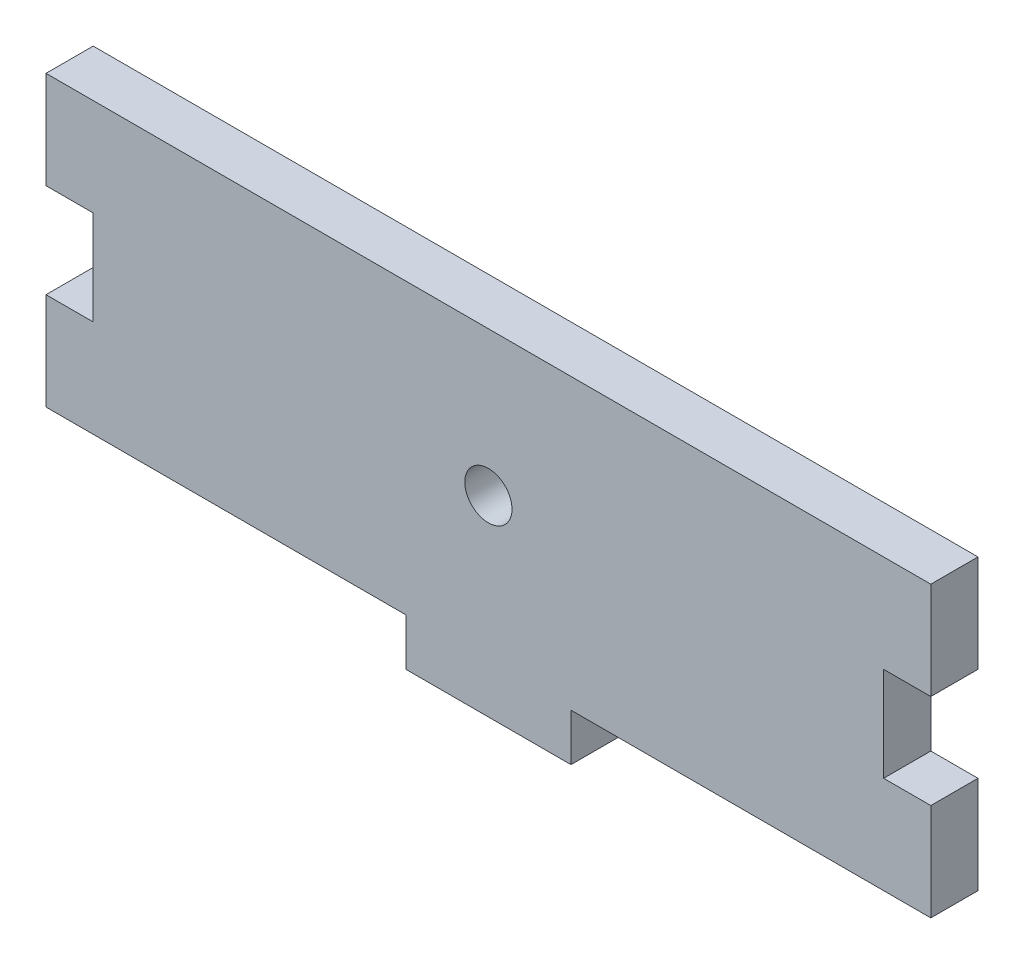
ISO-10303-21;
HEADER;
FILE_DESCRIPTION(('STEP AP214'),'2;1');
FILE_NAME('part.step','',(''),(''),'','','');
FILE_SCHEMA(('AUTOMOTIVE_DESIGN { 1 0 10303 214 1 1 1 1 }'));
ENDSEC;
DATA;
#1=APPLICATION_CONTEXT('core data for automotive mechanical design processes');
#2=APPLICATION_PROTOCOL_DEFINITION('international standard','automotive_design',2000,#1);
#3=PRODUCT_CONTEXT('',#1,'mechanical');
#4=PRODUCT('Part','Part','',(#3));
#5=PRODUCT_RELATED_PRODUCT_CATEGORY('part','',(#4));
#6=PRODUCT_DEFINITION_FORMATION('','',#4);
#7=PRODUCT_DEFINITION_CONTEXT('part definition',#1,'design');
#8=PRODUCT_DEFINITION('design','',#6,#7);
#9=PRODUCT_DEFINITION_SHAPE('','',#8);
#10=(LENGTH_UNIT() NAMED_UNIT(*) SI_UNIT(.MILLI.,.METRE.));
#11=(NAMED_UNIT(*) PLANE_ANGLE_UNIT() SI_UNIT($,.RADIAN.));
#12=(NAMED_UNIT(*) SI_UNIT($,.STERADIAN.) SOLID_ANGLE_UNIT());
#13=UNCERTAINTY_MEASURE_WITH_UNIT(LENGTH_MEASURE(1.E-05),#10,'distance_accuracy_value','');
#14=(GEOMETRIC_REPRESENTATION_CONTEXT(3) GLOBAL_UNCERTAINTY_ASSIGNED_CONTEXT((#13)) GLOBAL_UNIT_ASSIGNED_CONTEXT((#10,
#11,#12)) REPRESENTATION_CONTEXT('',''));
#15=CARTESIAN_POINT('',(0.,0.,0.));
#16=DIRECTION('',(0.,0.,1.));
#17=DIRECTION('',(1.,0.,0.));
#18=AXIS2_PLACEMENT_3D('',#15,#16,#17);
#19=CARTESIAN_POINT('',(-37.5,-12.25,4.));
#20=DIRECTION('',(0.,0.,-1.));
#21=DIRECTION('',(-1.,0.,0.));
#22=AXIS2_PLACEMENT_3D('',#19,#20,#21);
#23=PLANE('',#22);
#24=DIRECTION('',(0.,-1.,0.));
#25=VECTOR('',#24,1.);
#26=CARTESIAN_POINT('',(-37.5,-4.00000000000001,4.));
#27=LINE('',#26,#25);
#28=CARTESIAN_POINT('',(-37.5,-4.00000000000001,4.));
#29=VERTEX_POINT('',#28);
#30=CARTESIAN_POINT('',(-37.5,-12.25,4.));
#31=VERTEX_POINT('',#30);
#32=EDGE_CURVE('E216',#29,#31,#27,.T.);
#33=ORIENTED_EDGE('',*,*,#32,.T.);
#34=DIRECTION('',(1.,0.,0.));
#35=VECTOR('',#34,1.);
#36=CARTESIAN_POINT('',(-6.99999999999999,-12.25,4.));
#37=LINE('',#36,#35);
#38=CARTESIAN_POINT('',(-6.99999999999999,-12.25,4.));
#39=VERTEX_POINT('',#38);
#40=EDGE_CURVE('E124',#31,#39,#37,.T.);
#41=ORIENTED_EDGE('',*,*,#40,.T.);
#42=DIRECTION('',(0.,-1.,0.));
#43=VECTOR('',#42,1.);
#44=CARTESIAN_POINT('',(-7.,-16.25,4.));
#45=LINE('',#44,#43);
#46=CARTESIAN_POINT('',(-7.,-16.25,4.));
#47=VERTEX_POINT('',#46);
#48=EDGE_CURVE('E255',#39,#47,#45,.T.);
#49=ORIENTED_EDGE('',*,*,#48,.T.);
#50=DIRECTION('',(1.,0.,0.));
#51=VECTOR('',#50,1.);
#52=CARTESIAN_POINT('',(7.,-16.25,4.));
#53=LINE('',#52,#51);
#54=CARTESIAN_POINT('',(7.,-16.25,4.));
#55=VERTEX_POINT('',#54);
#56=EDGE_CURVE('E274',#47,#55,#53,.T.);
#57=ORIENTED_EDGE('',*,*,#56,.T.);
#58=DIRECTION('',(0.,1.,0.));
#59=VECTOR('',#58,1.);
#60=CARTESIAN_POINT('',(7.00000000000001,-12.25,4.));
#61=LINE('',#60,#59);
#62=CARTESIAN_POINT('',(7.00000000000001,-12.25,4.));
#63=VERTEX_POINT('',#62);
#64=EDGE_CURVE('E271',#55,#63,#61,.T.);
#65=ORIENTED_EDGE('',*,*,#64,.T.);
#66=DIRECTION('',(1.,0.,0.));
#67=VECTOR('',#66,1.);
#68=CARTESIAN_POINT('',(37.5,-12.25,4.));
#69=LINE('',#68,#67);
#70=CARTESIAN_POINT('',(37.5,-12.25,4.));
#71=VERTEX_POINT('',#70);
#72=EDGE_CURVE('E273',#63,#71,#69,.T.);
#73=ORIENTED_EDGE('',*,*,#72,.T.);
#74=DIRECTION('',(0.,1.,0.));
#75=VECTOR('',#74,1.);
#76=CARTESIAN_POINT('',(37.5,-3.99999999999999,4.));
#77=LINE('',#76,#75);
#78=CARTESIAN_POINT('',(37.5,-3.99999999999999,4.));
#79=VERTEX_POINT('',#78);
#80=EDGE_CURVE('E276',#71,#79,#77,.T.);
#81=ORIENTED_EDGE('',*,*,#80,.T.);
#82=DIRECTION('',(-1.,0.,0.));
#83=VECTOR('',#82,1.);
#84=CARTESIAN_POINT('',(33.4999999999999,-3.99999999999999,4.));
#85=LINE('',#84,#83);
#86=CARTESIAN_POINT('',(33.4999999999999,-3.99999999999999,4.));
#87=VERTEX_POINT('',#86);
#88=EDGE_CURVE('E282',#79,#87,#85,.T.);
#89=ORIENTED_EDGE('',*,*,#88,.T.);
#90=DIRECTION('',(0.,1.,0.));
#91=VECTOR('',#90,1.);
#92=CARTESIAN_POINT('',(33.5,3.99999999999999,4.));
#93=LINE('',#92,#91);
#94=CARTESIAN_POINT('',(33.5,3.99999999999999,4.));
#95=VERTEX_POINT('',#94);
#96=EDGE_CURVE('E284',#87,#95,#93,.T.);
#97=ORIENTED_EDGE('',*,*,#96,.T.);
#98=DIRECTION('',(1.,0.,0.));
#99=VECTOR('',#98,1.);
#100=CARTESIAN_POINT('',(37.5,4.,4.));
#101=LINE('',#100,#99);
#102=CARTESIAN_POINT('',(37.5,4.,4.));
#103=VERTEX_POINT('',#102);
#104=EDGE_CURVE('E286',#95,#103,#101,.T.);
#105=ORIENTED_EDGE('',*,*,#104,.T.);
#106=DIRECTION('',(0.,1.,0.));
#107=VECTOR('',#106,1.);
#108=CARTESIAN_POINT('',(37.5,12.25,4.));
#109=LINE('',#108,#107);
#110=CARTESIAN_POINT('',(37.5,12.25,4.));
#111=VERTEX_POINT('',#110);
#112=EDGE_CURVE('E288',#103,#111,#109,.T.);
#113=ORIENTED_EDGE('',*,*,#112,.T.);
#114=DIRECTION('',(-1.,0.,0.));
#115=VECTOR('',#114,1.);
#116=CARTESIAN_POINT('',(37.5,12.25,4.));
#117=LINE('',#116,#115);
#118=CARTESIAN_POINT('',(-37.5,12.25,4.));
#119=VERTEX_POINT('',#118);
#120=EDGE_CURVE('E290',#111,#119,#117,.T.);
#121=ORIENTED_EDGE('',*,*,#120,.T.);
#122=DIRECTION('',(0.,-1.,0.));
#123=VECTOR('',#122,1.);
#124=CARTESIAN_POINT('',(-37.5,12.25,4.));
#125=LINE('',#124,#123);
#126=CARTESIAN_POINT('',(-37.5,4.00000000000002,4.));
#127=VERTEX_POINT('',#126);
#128=EDGE_CURVE('E167',#119,#127,#125,.T.);
#129=ORIENTED_EDGE('',*,*,#128,.T.);
#130=DIRECTION('',(1.,0.,0.));
#131=VECTOR('',#130,1.);
#132=CARTESIAN_POINT('',(-37.5,4.00000000000002,4.));
#133=LINE('',#132,#131);
#134=CARTESIAN_POINT('',(-33.5,4.00000000000001,4.));
#135=VERTEX_POINT('',#134);
#136=EDGE_CURVE('E161',#127,#135,#133,.T.);
#137=ORIENTED_EDGE('',*,*,#136,.T.);
#138=DIRECTION('',(0.,-1.,0.));
#139=VECTOR('',#138,1.);
#140=CARTESIAN_POINT('',(-33.5,4.00000000000001,4.));
#141=LINE('',#140,#139);
#142=CARTESIAN_POINT('',(-33.5,-4.,4.));
#143=VERTEX_POINT('',#142);
#144=EDGE_CURVE('E165',#135,#143,#141,.T.);
#145=ORIENTED_EDGE('',*,*,#144,.T.);
#146=DIRECTION('',(-1.,0.,0.));
#147=VECTOR('',#146,1.);
#148=CARTESIAN_POINT('',(-33.5,-4.,4.));
#149=LINE('',#148,#147);
#150=EDGE_CURVE('E57',#143,#29,#149,.T.);
#151=ORIENTED_EDGE('',*,*,#150,.T.);
#152=EDGE_LOOP('',(#33,#41,#49,#57,#65,#73,#81,#89,#97,#105,#113,#121,#129,#137,#145,#151));
#153=FACE_BOUND('',#152,.T.);
#154=CARTESIAN_POINT('',(0.,0.,4.));
#155=DIRECTION('',(0.,0.,1.));
#156=DIRECTION('',(1.,0.,0.));
#157=AXIS2_PLACEMENT_3D('',#154,#155,#156);
#158=CIRCLE('',#157,2.);
#159=CARTESIAN_POINT('',(2.00000000000001,0.,4.));
#160=VERTEX_POINT('',#159);
#161=EDGE_CURVE('E189',#160,#160,#158,.T.);
#162=ORIENTED_EDGE('',*,*,#161,.F.);
#163=EDGE_LOOP('',(#162));
#164=FACE_BOUND('',#163,.T.);
#165=ADVANCED_FACE('F40',(#153,#164),#23,.F.);
#166=CARTESIAN_POINT('',(-37.5,-12.25,0.));
#167=DIRECTION('',(0.,0.,-1.));
#168=DIRECTION('',(-1.,0.,0.));
#169=AXIS2_PLACEMENT_3D('',#166,#167,#168);
#170=PLANE('',#169);
#171=DIRECTION('',(0.,-1.,0.));
#172=VECTOR('',#171,1.);
#173=CARTESIAN_POINT('',(-37.5,-4.00000000000001,0.));
#174=LINE('',#173,#172);
#175=CARTESIAN_POINT('',(-37.5,-4.00000000000001,0.));
#176=VERTEX_POINT('',#175);
#177=CARTESIAN_POINT('',(-37.5,-12.25,0.));
#178=VERTEX_POINT('',#177);
#179=EDGE_CURVE('E185',#176,#178,#174,.T.);
#180=ORIENTED_EDGE('',*,*,#179,.F.);
#181=DIRECTION('',(-1.,0.,0.));
#182=VECTOR('',#181,1.);
#183=CARTESIAN_POINT('',(-33.5,-4.,0.));
#184=LINE('',#183,#182);
#185=CARTESIAN_POINT('',(-33.5,-4.,0.));
#186=VERTEX_POINT('',#185);
#187=EDGE_CURVE('E116',#186,#176,#184,.T.);
#188=ORIENTED_EDGE('',*,*,#187,.F.);
#189=DIRECTION('',(0.,-1.,0.));
#190=VECTOR('',#189,1.);
#191=CARTESIAN_POINT('',(-33.5,4.00000000000001,0.));
#192=LINE('',#191,#190);
#193=CARTESIAN_POINT('',(-33.5,4.00000000000001,0.));
#194=VERTEX_POINT('',#193);
#195=EDGE_CURVE('E110',#194,#186,#192,.T.);
#196=ORIENTED_EDGE('',*,*,#195,.F.);
#197=DIRECTION('',(1.,0.,0.));
#198=VECTOR('',#197,1.);
#199=CARTESIAN_POINT('',(-37.5,4.00000000000002,0.));
#200=LINE('',#199,#198);
#201=CARTESIAN_POINT('',(-37.5,4.00000000000002,0.));
#202=VERTEX_POINT('',#201);
#203=EDGE_CURVE('E175',#202,#194,#200,.T.);
#204=ORIENTED_EDGE('',*,*,#203,.F.);
#205=DIRECTION('',(0.,-1.,0.));
#206=VECTOR('',#205,1.);
#207=CARTESIAN_POINT('',(-37.5,12.25,0.));
#208=LINE('',#207,#206);
#209=CARTESIAN_POINT('',(-37.5,12.25,0.));
#210=VERTEX_POINT('',#209);
#211=EDGE_CURVE('E211',#210,#202,#208,.T.);
#212=ORIENTED_EDGE('',*,*,#211,.F.);
#213=DIRECTION('',(-1.,0.,0.));
#214=VECTOR('',#213,1.);
#215=CARTESIAN_POINT('',(37.5,12.25,0.));
#216=LINE('',#215,#214);
#217=CARTESIAN_POINT('',(37.5,12.25,0.));
#218=VERTEX_POINT('',#217);
#219=EDGE_CURVE('E209',#218,#210,#216,.T.);
#220=ORIENTED_EDGE('',*,*,#219,.F.);
#221=DIRECTION('',(0.,1.,0.));
#222=VECTOR('',#221,1.);
#223=CARTESIAN_POINT('',(37.5,12.25,0.));
#224=LINE('',#223,#222);
#225=CARTESIAN_POINT('',(37.5,4.,0.));
#226=VERTEX_POINT('',#225);
#227=EDGE_CURVE('E207',#226,#218,#224,.T.);
#228=ORIENTED_EDGE('',*,*,#227,.F.);
#229=DIRECTION('',(1.,0.,0.));
#230=VECTOR('',#229,1.);
#231=CARTESIAN_POINT('',(37.5,4.,0.));
#232=LINE('',#231,#230);
#233=CARTESIAN_POINT('',(33.5,3.99999999999999,0.));
#234=VERTEX_POINT('',#233);
#235=EDGE_CURVE('E205',#234,#226,#232,.T.);
#236=ORIENTED_EDGE('',*,*,#235,.F.);
#237=DIRECTION('',(0.,1.,0.));
#238=VECTOR('',#237,1.);
#239=CARTESIAN_POINT('',(33.5,3.99999999999999,0.));
#240=LINE('',#239,#238);
#241=CARTESIAN_POINT('',(33.5,-4.00000000000001,0.));
#242=VERTEX_POINT('',#241);
#243=EDGE_CURVE('E203',#242,#234,#240,.T.);
#244=ORIENTED_EDGE('',*,*,#243,.F.);
#245=DIRECTION('',(-1.,0.,0.));
#246=VECTOR('',#245,1.);
#247=CARTESIAN_POINT('',(33.5,-4.00000000000001,0.));
#248=LINE('',#247,#246);
#249=CARTESIAN_POINT('',(37.5,-3.99999999999999,0.));
#250=VERTEX_POINT('',#249);
#251=EDGE_CURVE('E201',#250,#242,#248,.T.);
#252=ORIENTED_EDGE('',*,*,#251,.F.);
#253=DIRECTION('',(0.,1.,0.));
#254=VECTOR('',#253,1.);
#255=CARTESIAN_POINT('',(37.5,-3.99999999999999,0.));
#256=LINE('',#255,#254);
#257=CARTESIAN_POINT('',(37.5,-12.25,0.));
#258=VERTEX_POINT('',#257);
#259=EDGE_CURVE('E199',#258,#250,#256,.T.);
#260=ORIENTED_EDGE('',*,*,#259,.F.);
#261=DIRECTION('',(1.,0.,0.));
#262=VECTOR('',#261,1.);
#263=CARTESIAN_POINT('',(37.5,-12.25,0.));
#264=LINE('',#263,#262);
#265=CARTESIAN_POINT('',(7.00000000000001,-12.25,0.));
#266=VERTEX_POINT('',#265);
#267=EDGE_CURVE('E197',#266,#258,#264,.T.);
#268=ORIENTED_EDGE('',*,*,#267,.F.);
#269=DIRECTION('',(0.,1.,0.));
#270=VECTOR('',#269,1.);
#271=CARTESIAN_POINT('',(7.00000000000001,-12.25,0.));
#272=LINE('',#271,#270);
#273=CARTESIAN_POINT('',(7.,-16.25,0.));
#274=VERTEX_POINT('',#273);
#275=EDGE_CURVE('E195',#274,#266,#272,.T.);
#276=ORIENTED_EDGE('',*,*,#275,.F.);
#277=DIRECTION('',(1.,0.,0.));
#278=VECTOR('',#277,1.);
#279=CARTESIAN_POINT('',(7.,-16.25,0.));
#280=LINE('',#279,#278);
#281=CARTESIAN_POINT('',(-7.,-16.25,0.));
#282=VERTEX_POINT('',#281);
#283=EDGE_CURVE('E193',#282,#274,#280,.T.);
#284=ORIENTED_EDGE('',*,*,#283,.F.);
#285=DIRECTION('',(0.,-1.,0.));
#286=VECTOR('',#285,1.);
#287=CARTESIAN_POINT('',(-7.,-16.25,0.));
#288=LINE('',#287,#286);
#289=CARTESIAN_POINT('',(-6.99999999999999,-12.25,0.));
#290=VERTEX_POINT('',#289);
#291=EDGE_CURVE('E191',#290,#282,#288,.T.);
#292=ORIENTED_EDGE('',*,*,#291,.F.);
#293=DIRECTION('',(1.,0.,0.));
#294=VECTOR('',#293,1.);
#295=CARTESIAN_POINT('',(-6.99999999999999,-12.25,0.));
#296=LINE('',#295,#294);
#297=EDGE_CURVE('E188',#178,#290,#296,.T.);
#298=ORIENTED_EDGE('',*,*,#297,.F.);
#299=EDGE_LOOP('',(#180,#188,#196,#204,#212,#220,#228,#236,#244,#252,#260,#268,#276,#284,#292,#298));
#300=FACE_BOUND('',#299,.T.);
#301=CARTESIAN_POINT('',(0.,0.,0.));
#302=DIRECTION('',(0.,0.,1.));
#303=DIRECTION('',(1.,0.,0.));
#304=AXIS2_PLACEMENT_3D('',#301,#302,#303);
#305=CIRCLE('',#304,2.);
#306=CARTESIAN_POINT('',(2.00000000000001,0.,0.));
#307=VERTEX_POINT('',#306);
#308=EDGE_CURVE('E451',#307,#307,#305,.T.);
#309=ORIENTED_EDGE('',*,*,#308,.T.);
#310=EDGE_LOOP('',(#309));
#311=FACE_BOUND('',#310,.T.);
#312=ADVANCED_FACE('F259',(#300,#311),#170,.T.);
#313=CARTESIAN_POINT('',(-37.5,-4.00000000000001,4.));
#314=DIRECTION('',(1.,0.,0.));
#315=DIRECTION('',(0.,0.,-1.));
#316=AXIS2_PLACEMENT_3D('',#313,#314,#315);
#317=PLANE('',#316);
#318=ORIENTED_EDGE('',*,*,#179,.T.);
#319=DIRECTION('',(0.,0.,-1.));
#320=VECTOR('',#319,1.);
#321=CARTESIAN_POINT('',(-37.5,-12.25,4.));
#322=LINE('',#321,#320);
#323=EDGE_CURVE('E13',#31,#178,#322,.T.);
#324=ORIENTED_EDGE('',*,*,#323,.F.);
#325=ORIENTED_EDGE('',*,*,#32,.F.);
#326=DIRECTION('',(0.,0.,-1.));
#327=VECTOR('',#326,1.);
#328=CARTESIAN_POINT('',(-37.5,-4.00000000000001,4.));
#329=LINE('',#328,#327);
#330=EDGE_CURVE('E181',#29,#176,#329,.T.);
#331=ORIENTED_EDGE('',*,*,#330,.T.);
#332=EDGE_LOOP('',(#318,#324,#325,#331));
#333=FACE_BOUND('',#332,.T.);
#334=ADVANCED_FACE('F42',(#333),#317,.F.);
#335=CARTESIAN_POINT('',(-6.99999999999999,-12.25,4.));
#336=DIRECTION('',(0.,1.,0.));
#337=DIRECTION('',(-1.,0.,0.));
#338=AXIS2_PLACEMENT_3D('',#335,#336,#337);
#339=PLANE('',#338);
#340=ORIENTED_EDGE('',*,*,#297,.T.);
#341=DIRECTION('',(0.,0.,-1.));
#342=VECTOR('',#341,1.);
#343=CARTESIAN_POINT('',(-6.99999999999999,-12.25,4.));
#344=LINE('',#343,#342);
#345=EDGE_CURVE('E49',#39,#290,#344,.T.);
#346=ORIENTED_EDGE('',*,*,#345,.F.);
#347=ORIENTED_EDGE('',*,*,#40,.F.);
#348=ORIENTED_EDGE('',*,*,#323,.T.);
#349=EDGE_LOOP('',(#340,#346,#347,#348));
#350=FACE_BOUND('',#349,.T.);
#351=ADVANCED_FACE('F324',(#350),#339,.F.);
#352=CARTESIAN_POINT('',(-7.,-16.25,4.));
#353=DIRECTION('',(1.,0.,0.));
#354=DIRECTION('',(0.,0.,-1.));
#355=AXIS2_PLACEMENT_3D('',#352,#353,#354);
#356=PLANE('',#355);
#357=ORIENTED_EDGE('',*,*,#291,.T.);
#358=DIRECTION('',(0.,0.,-1.));
#359=VECTOR('',#358,1.);
#360=CARTESIAN_POINT('',(-7.,-16.25,4.));
#361=LINE('',#360,#359);
#362=EDGE_CURVE('E247',#47,#282,#361,.T.);
#363=ORIENTED_EDGE('',*,*,#362,.F.);
#364=ORIENTED_EDGE('',*,*,#48,.F.);
#365=ORIENTED_EDGE('',*,*,#345,.T.);
#366=EDGE_LOOP('',(#357,#363,#364,#365));
#367=FACE_BOUND('',#366,.T.);
#368=ADVANCED_FACE('F253',(#367),#356,.F.);
#369=CARTESIAN_POINT('',(7.,-16.25,4.));
#370=DIRECTION('',(0.,1.,0.));
#371=DIRECTION('',(0.,0.,1.));
#372=AXIS2_PLACEMENT_3D('',#369,#370,#371);
#373=PLANE('',#372);
#374=ORIENTED_EDGE('',*,*,#283,.T.);
#375=DIRECTION('',(0.,0.,-1.));
#376=VECTOR('',#375,1.);
#377=CARTESIAN_POINT('',(7.,-16.25,4.));
#378=LINE('',#377,#376);
#379=EDGE_CURVE('E244',#55,#274,#378,.T.);
#380=ORIENTED_EDGE('',*,*,#379,.F.);
#381=ORIENTED_EDGE('',*,*,#56,.F.);
#382=ORIENTED_EDGE('',*,*,#362,.T.);
#383=EDGE_LOOP('',(#374,#380,#381,#382));
#384=FACE_BOUND('',#383,.T.);
#385=ADVANCED_FACE('F265',(#384),#373,.F.);
#386=CARTESIAN_POINT('',(7.00000000000001,-12.25,4.));
#387=DIRECTION('',(-1.,0.,0.));
#388=DIRECTION('',(0.,-1.,0.));
#389=AXIS2_PLACEMENT_3D('',#386,#387,#388);
#390=PLANE('',#389);
#391=ORIENTED_EDGE('',*,*,#275,.T.);
#392=DIRECTION('',(0.,0.,-1.));
#393=VECTOR('',#392,1.);
#394=CARTESIAN_POINT('',(7.00000000000001,-12.25,4.));
#395=LINE('',#394,#393);
#396=EDGE_CURVE('E241',#63,#266,#395,.T.);
#397=ORIENTED_EDGE('',*,*,#396,.F.);
#398=ORIENTED_EDGE('',*,*,#64,.F.);
#399=ORIENTED_EDGE('',*,*,#379,.T.);
#400=EDGE_LOOP('',(#391,#397,#398,#399));
#401=FACE_BOUND('',#400,.T.);
#402=ADVANCED_FACE('F269',(#401),#390,.F.);
#403=CARTESIAN_POINT('',(37.5,-12.25,4.));
#404=DIRECTION('',(0.,1.,0.));
#405=DIRECTION('',(-1.,0.,0.));
#406=AXIS2_PLACEMENT_3D('',#403,#404,#405);
#407=PLANE('',#406);
#408=ORIENTED_EDGE('',*,*,#267,.T.);
#409=DIRECTION('',(0.,0.,-1.));
#410=VECTOR('',#409,1.);
#411=CARTESIAN_POINT('',(37.5,-12.25,4.));
#412=LINE('',#411,#410);
#413=EDGE_CURVE('E238',#71,#258,#412,.T.);
#414=ORIENTED_EDGE('',*,*,#413,.F.);
#415=ORIENTED_EDGE('',*,*,#72,.F.);
#416=ORIENTED_EDGE('',*,*,#396,.T.);
#417=EDGE_LOOP('',(#408,#414,#415,#416));
#418=FACE_BOUND('',#417,.T.);
#419=ADVANCED_FACE('F337',(#418),#407,.F.);
#420=CARTESIAN_POINT('',(37.5,-3.99999999999999,4.));
#421=DIRECTION('',(-1.,0.,0.));
#422=DIRECTION('',(0.,0.,1.));
#423=AXIS2_PLACEMENT_3D('',#420,#421,#422);
#424=PLANE('',#423);
#425=ORIENTED_EDGE('',*,*,#259,.T.);
#426=DIRECTION('',(0.,0.,-1.));
#427=VECTOR('',#426,1.);
#428=CARTESIAN_POINT('',(37.5,-3.99999999999999,4.));
#429=LINE('',#428,#427);
#430=EDGE_CURVE('E235',#79,#250,#429,.T.);
#431=ORIENTED_EDGE('',*,*,#430,.F.);
#432=ORIENTED_EDGE('',*,*,#80,.F.);
#433=ORIENTED_EDGE('',*,*,#413,.T.);
#434=EDGE_LOOP('',(#425,#431,#432,#433));
#435=FACE_BOUND('',#434,.T.);
#436=ADVANCED_FACE('F340',(#435),#424,.F.);
#437=CARTESIAN_POINT('',(33.4999999999999,-3.99999999999999,4.));
#438=DIRECTION('',(0.,-1.,0.));
#439=DIRECTION('',(1.,0.,0.));
#440=AXIS2_PLACEMENT_3D('',#437,#438,#439);
#441=PLANE('',#440);
#442=ORIENTED_EDGE('',*,*,#251,.T.);
#443=DIRECTION('',(0.,0.,-1.));
#444=VECTOR('',#443,1.);
#445=CARTESIAN_POINT('',(33.4999999999999,-3.99999999999999,4.));
#446=LINE('',#445,#444);
#447=EDGE_CURVE('E232',#87,#242,#446,.T.);
#448=ORIENTED_EDGE('',*,*,#447,.F.);
#449=ORIENTED_EDGE('',*,*,#88,.F.);
#450=ORIENTED_EDGE('',*,*,#430,.T.);
#451=EDGE_LOOP('',(#442,#448,#449,#450));
#452=FACE_BOUND('',#451,.T.);
#453=ADVANCED_FACE('F344',(#452),#441,.F.);
#454=CARTESIAN_POINT('',(33.5,3.99999999999999,4.));
#455=DIRECTION('',(-1.,0.,0.));
#456=DIRECTION('',(0.,0.,1.));
#457=AXIS2_PLACEMENT_3D('',#454,#455,#456);
#458=PLANE('',#457);
#459=ORIENTED_EDGE('',*,*,#243,.T.);
#460=DIRECTION('',(0.,0.,-1.));
#461=VECTOR('',#460,1.);
#462=CARTESIAN_POINT('',(33.5,3.99999999999999,4.));
#463=LINE('',#462,#461);
#464=EDGE_CURVE('E229',#95,#234,#463,.T.);
#465=ORIENTED_EDGE('',*,*,#464,.F.);
#466=ORIENTED_EDGE('',*,*,#96,.F.);
#467=ORIENTED_EDGE('',*,*,#447,.T.);
#468=EDGE_LOOP('',(#459,#465,#466,#467));
#469=FACE_BOUND('',#468,.T.);
#470=ADVANCED_FACE('F348',(#469),#458,.F.);
#471=CARTESIAN_POINT('',(37.5,4.,4.));
#472=DIRECTION('',(0.,1.,0.));
#473=DIRECTION('',(-1.,0.,0.));
#474=AXIS2_PLACEMENT_3D('',#471,#472,#473);
#475=PLANE('',#474);
#476=ORIENTED_EDGE('',*,*,#235,.T.);
#477=DIRECTION('',(0.,0.,-1.));
#478=VECTOR('',#477,1.);
#479=CARTESIAN_POINT('',(37.5,4.,4.));
#480=LINE('',#479,#478);
#481=EDGE_CURVE('E226',#103,#226,#480,.T.);
#482=ORIENTED_EDGE('',*,*,#481,.F.);
#483=ORIENTED_EDGE('',*,*,#104,.F.);
#484=ORIENTED_EDGE('',*,*,#464,.T.);
#485=EDGE_LOOP('',(#476,#482,#483,#484));
#486=FACE_BOUND('',#485,.T.);
#487=ADVANCED_FACE('F352',(#486),#475,.F.);
#488=CARTESIAN_POINT('',(37.5,12.25,4.));
#489=DIRECTION('',(-1.,0.,0.));
#490=DIRECTION('',(0.,0.,1.));
#491=AXIS2_PLACEMENT_3D('',#488,#489,#490);
#492=PLANE('',#491);
#493=ORIENTED_EDGE('',*,*,#227,.T.);
#494=DIRECTION('',(0.,0.,-1.));
#495=VECTOR('',#494,1.);
#496=CARTESIAN_POINT('',(37.5,12.25,4.));
#497=LINE('',#496,#495);
#498=EDGE_CURVE('E223',#111,#218,#497,.T.);
#499=ORIENTED_EDGE('',*,*,#498,.F.);
#500=ORIENTED_EDGE('',*,*,#112,.F.);
#501=ORIENTED_EDGE('',*,*,#481,.T.);
#502=EDGE_LOOP('',(#493,#499,#500,#501));
#503=FACE_BOUND('',#502,.T.);
#504=ADVANCED_FACE('F356',(#503),#492,.F.);
#505=CARTESIAN_POINT('',(37.5,12.25,4.));
#506=DIRECTION('',(0.,-1.,0.));
#507=DIRECTION('',(1.,0.,0.));
#508=AXIS2_PLACEMENT_3D('',#505,#506,#507);
#509=PLANE('',#508);
#510=ORIENTED_EDGE('',*,*,#219,.T.);
#511=DIRECTION('',(0.,0.,-1.));
#512=VECTOR('',#511,1.);
#513=CARTESIAN_POINT('',(-37.5,12.25,4.));
#514=LINE('',#513,#512);
#515=EDGE_CURVE('E220',#119,#210,#514,.T.);
#516=ORIENTED_EDGE('',*,*,#515,.F.);
#517=ORIENTED_EDGE('',*,*,#120,.F.);
#518=ORIENTED_EDGE('',*,*,#498,.T.);
#519=EDGE_LOOP('',(#510,#516,#517,#518));
#520=FACE_BOUND('',#519,.T.);
#521=ADVANCED_FACE('F296',(#520),#509,.F.);
#522=CARTESIAN_POINT('',(-37.5,12.25,4.));
#523=DIRECTION('',(1.,0.,0.));
#524=DIRECTION('',(0.,0.,-1.));
#525=AXIS2_PLACEMENT_3D('',#522,#523,#524);
#526=PLANE('',#525);
#527=ORIENTED_EDGE('',*,*,#211,.T.);
#528=DIRECTION('',(0.,0.,-1.));
#529=VECTOR('',#528,1.);
#530=CARTESIAN_POINT('',(-37.5,4.00000000000002,4.));
#531=LINE('',#530,#529);
#532=EDGE_CURVE('E176',#127,#202,#531,.T.);
#533=ORIENTED_EDGE('',*,*,#532,.F.);
#534=ORIENTED_EDGE('',*,*,#128,.F.);
#535=ORIENTED_EDGE('',*,*,#515,.T.);
#536=EDGE_LOOP('',(#527,#533,#534,#535));
#537=FACE_BOUND('',#536,.T.);
#538=ADVANCED_FACE('F300',(#537),#526,.F.);
#539=CARTESIAN_POINT('',(-37.5,4.00000000000002,4.));
#540=DIRECTION('',(0.,1.,0.));
#541=DIRECTION('',(-1.,0.,0.));
#542=AXIS2_PLACEMENT_3D('',#539,#540,#541);
#543=PLANE('',#542);
#544=ORIENTED_EDGE('',*,*,#203,.T.);
#545=DIRECTION('',(0.,0.,-1.));
#546=VECTOR('',#545,1.);
#547=CARTESIAN_POINT('',(-33.5,4.00000000000001,4.));
#548=LINE('',#547,#546);
#549=EDGE_CURVE('E172',#135,#194,#548,.T.);
#550=ORIENTED_EDGE('',*,*,#549,.F.);
#551=ORIENTED_EDGE('',*,*,#136,.F.);
#552=ORIENTED_EDGE('',*,*,#532,.T.);
#553=EDGE_LOOP('',(#544,#550,#551,#552));
#554=FACE_BOUND('',#553,.T.);
#555=ADVANCED_FACE('F173',(#554),#543,.F.);
#556=CARTESIAN_POINT('',(-33.5,4.00000000000001,4.));
#557=DIRECTION('',(1.,0.,0.));
#558=DIRECTION('',(0.,0.,-1.));
#559=AXIS2_PLACEMENT_3D('',#556,#557,#558);
#560=PLANE('',#559);
#561=ORIENTED_EDGE('',*,*,#195,.T.);
#562=DIRECTION('',(0.,0.,-1.));
#563=VECTOR('',#562,1.);
#564=CARTESIAN_POINT('',(-33.5,-4.,4.));
#565=LINE('',#564,#563);
#566=EDGE_CURVE('E177',#143,#186,#565,.T.);
#567=ORIENTED_EDGE('',*,*,#566,.F.);
#568=ORIENTED_EDGE('',*,*,#144,.F.);
#569=ORIENTED_EDGE('',*,*,#549,.T.);
#570=EDGE_LOOP('',(#561,#567,#568,#569));
#571=FACE_BOUND('',#570,.T.);
#572=ADVANCED_FACE('F179',(#571),#560,.F.);
#573=CARTESIAN_POINT('',(-33.5,-4.,4.));
#574=DIRECTION('',(0.,-1.,0.));
#575=DIRECTION('',(1.,0.,0.));
#576=AXIS2_PLACEMENT_3D('',#573,#574,#575);
#577=PLANE('',#576);
#578=ORIENTED_EDGE('',*,*,#187,.T.);
#579=ORIENTED_EDGE('',*,*,#330,.F.);
#580=ORIENTED_EDGE('',*,*,#150,.F.);
#581=ORIENTED_EDGE('',*,*,#566,.T.);
#582=EDGE_LOOP('',(#578,#579,#580,#581));
#583=FACE_BOUND('',#582,.T.);
#584=ADVANCED_FACE('F304',(#583),#577,.F.);
#585=CARTESIAN_POINT('',(0.,0.,4.));
#586=DIRECTION('',(0.,0.,-1.));
#587=DIRECTION('',(-1.,0.,0.));
#588=AXIS2_PLACEMENT_3D('',#585,#586,#587);
#589=CYLINDRICAL_SURFACE('',#588,2.);
#590=ORIENTED_EDGE('',*,*,#161,.T.);
#591=EDGE_LOOP('',(#590));
#592=FACE_BOUND('',#591,.T.);
#593=ORIENTED_EDGE('',*,*,#308,.F.);
#594=EDGE_LOOP('',(#593));
#595=FACE_BOUND('',#594,.T.);
#596=ADVANCED_FACE('F306',(#592,#595),#589,.F.);
#597=CLOSED_SHELL('',(#165,#312,#334,#351,#368,#385,#402,#419,#436,#453,#470,#487,#504,#521,
#538,#555,#572,#584,#596));
#598=MANIFOLD_SOLID_BREP('B2',#597);
#599=ADVANCED_BREP_SHAPE_REPRESENTATION('',(#18,#598),#14);
#600=SHAPE_DEFINITION_REPRESENTATION(#9,#599);
ENDSEC;
END-ISO-10303-21;
